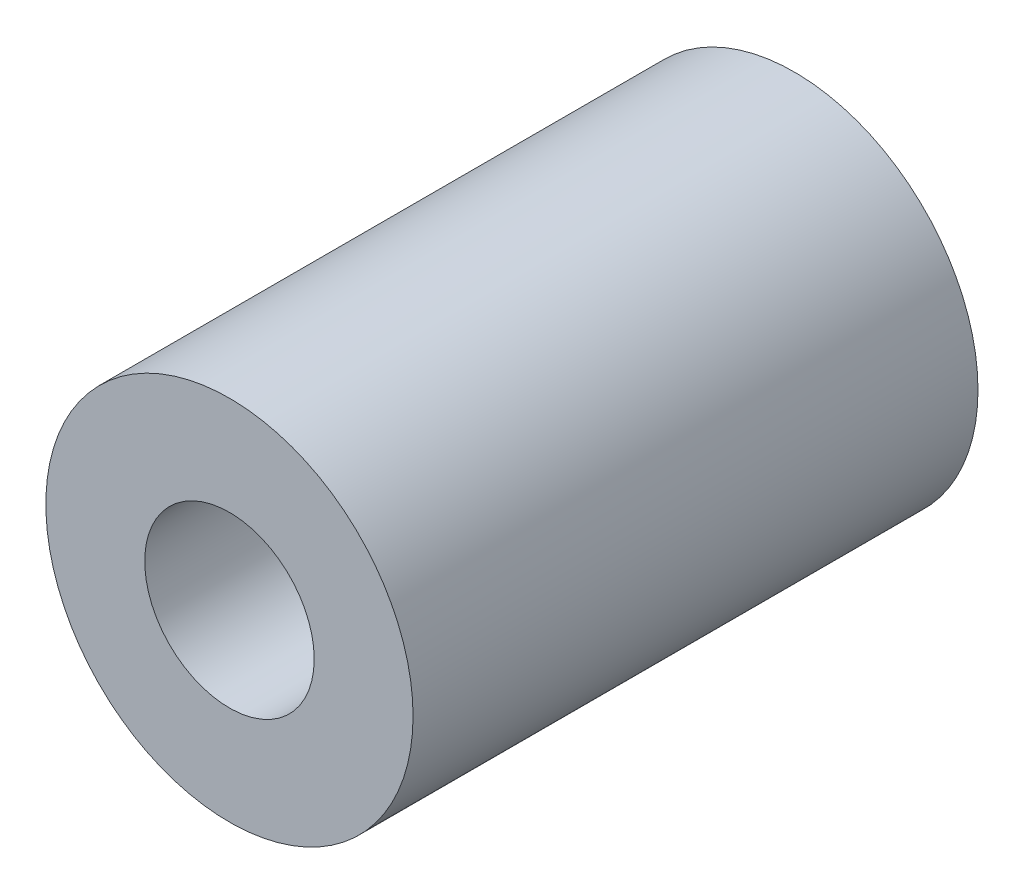
ISO-10303-21;
HEADER;
FILE_DESCRIPTION(('STEP AP214'),'2;1');
FILE_NAME('part.step','',(''),(''),'','','');
FILE_SCHEMA(('AUTOMOTIVE_DESIGN { 1 0 10303 214 1 1 1 1 }'));
ENDSEC;
DATA;
#1=APPLICATION_CONTEXT('core data for automotive mechanical design processes');
#2=APPLICATION_PROTOCOL_DEFINITION('international standard','automotive_design',2000,#1);
#3=PRODUCT_CONTEXT('',#1,'mechanical');
#4=PRODUCT('Part','Part','',(#3));
#5=PRODUCT_RELATED_PRODUCT_CATEGORY('part','',(#4));
#6=PRODUCT_DEFINITION_FORMATION('','',#4);
#7=PRODUCT_DEFINITION_CONTEXT('part definition',#1,'design');
#8=PRODUCT_DEFINITION('design','',#6,#7);
#9=PRODUCT_DEFINITION_SHAPE('','',#8);
#10=(LENGTH_UNIT() NAMED_UNIT(*) SI_UNIT(.MILLI.,.METRE.));
#11=(NAMED_UNIT(*) PLANE_ANGLE_UNIT() SI_UNIT($,.RADIAN.));
#12=(NAMED_UNIT(*) SI_UNIT($,.STERADIAN.) SOLID_ANGLE_UNIT());
#13=UNCERTAINTY_MEASURE_WITH_UNIT(LENGTH_MEASURE(1.E-05),#10,'distance_accuracy_value','');
#14=(GEOMETRIC_REPRESENTATION_CONTEXT(3) GLOBAL_UNCERTAINTY_ASSIGNED_CONTEXT((#13)) GLOBAL_UNIT_ASSIGNED_CONTEXT((#10,
#11,#12)) REPRESENTATION_CONTEXT('',''));
#15=CARTESIAN_POINT('',(0.,0.,0.));
#16=DIRECTION('',(0.,0.,1.));
#17=DIRECTION('',(1.,0.,0.));
#18=AXIS2_PLACEMENT_3D('',#15,#16,#17);
#19=CARTESIAN_POINT('',(0.,0.,20.));
#20=DIRECTION('',(0.,0.,1.));
#21=DIRECTION('',(1.,0.,0.));
#22=AXIS2_PLACEMENT_3D('',#19,#20,#21);
#23=PLANE('',#22);
#24=CARTESIAN_POINT('',(0.,0.,20.));
#25=DIRECTION('',(0.,0.,1.));
#26=DIRECTION('',(1.,0.,0.));
#27=AXIS2_PLACEMENT_3D('',#24,#25,#26);
#28=CIRCLE('',#27,6.5);
#29=CARTESIAN_POINT('',(6.5,0.,20.));
#30=VERTEX_POINT('',#29);
#31=EDGE_CURVE('E10',#30,#30,#28,.T.);
#32=ORIENTED_EDGE('',*,*,#31,.T.);
#33=EDGE_LOOP('',(#32));
#34=FACE_BOUND('',#33,.T.);
#35=CARTESIAN_POINT('',(0.,0.,20.));
#36=DIRECTION('',(0.,0.,1.));
#37=DIRECTION('',(1.,0.,0.));
#38=AXIS2_PLACEMENT_3D('',#35,#36,#37);
#39=CIRCLE('',#38,3.);
#40=CARTESIAN_POINT('',(3.,0.,20.));
#41=VERTEX_POINT('',#40);
#42=EDGE_CURVE('E42',#41,#41,#39,.T.);
#43=ORIENTED_EDGE('',*,*,#42,.F.);
#44=EDGE_LOOP('',(#43));
#45=FACE_BOUND('',#44,.T.);
#46=ADVANCED_FACE('F31',(#34,#45),#23,.T.);
#47=CARTESIAN_POINT('',(0.,0.,0.));
#48=DIRECTION('',(0.,0.,1.));
#49=DIRECTION('',(1.,0.,0.));
#50=AXIS2_PLACEMENT_3D('',#47,#48,#49);
#51=PLANE('',#50);
#52=CARTESIAN_POINT('',(0.,0.,0.));
#53=DIRECTION('',(0.,0.,1.));
#54=DIRECTION('',(1.,0.,0.));
#55=AXIS2_PLACEMENT_3D('',#52,#53,#54);
#56=CIRCLE('',#55,6.5);
#57=CARTESIAN_POINT('',(6.5,0.,0.));
#58=VERTEX_POINT('',#57);
#59=EDGE_CURVE('E35',#58,#58,#56,.T.);
#60=ORIENTED_EDGE('',*,*,#59,.F.);
#61=EDGE_LOOP('',(#60));
#62=FACE_BOUND('',#61,.T.);
#63=CARTESIAN_POINT('',(0.,0.,0.));
#64=DIRECTION('',(0.,0.,1.));
#65=DIRECTION('',(1.,0.,0.));
#66=AXIS2_PLACEMENT_3D('',#63,#64,#65);
#67=CIRCLE('',#66,3.);
#68=CARTESIAN_POINT('',(3.,0.,0.));
#69=VERTEX_POINT('',#68);
#70=EDGE_CURVE('E44',#69,#69,#67,.T.);
#71=ORIENTED_EDGE('',*,*,#70,.T.);
#72=EDGE_LOOP('',(#71));
#73=FACE_BOUND('',#72,.T.);
#74=ADVANCED_FACE('F54',(#62,#73),#51,.F.);
#75=CARTESIAN_POINT('',(0.,0.,20.));
#76=DIRECTION('',(0.,0.,-1.));
#77=DIRECTION('',(-1.,0.,0.));
#78=AXIS2_PLACEMENT_3D('',#75,#76,#77);
#79=CYLINDRICAL_SURFACE('',#78,6.5);
#80=ORIENTED_EDGE('',*,*,#31,.F.);
#81=EDGE_LOOP('',(#80));
#82=FACE_BOUND('',#81,.T.);
#83=ORIENTED_EDGE('',*,*,#59,.T.);
#84=EDGE_LOOP('',(#83));
#85=FACE_BOUND('',#84,.T.);
#86=ADVANCED_FACE('F33',(#82,#85),#79,.T.);
#87=CARTESIAN_POINT('',(0.,0.,20.));
#88=DIRECTION('',(0.,0.,-1.));
#89=DIRECTION('',(-1.,0.,0.));
#90=AXIS2_PLACEMENT_3D('',#87,#88,#89);
#91=CYLINDRICAL_SURFACE('',#90,3.);
#92=ORIENTED_EDGE('',*,*,#42,.T.);
#93=EDGE_LOOP('',(#92));
#94=FACE_BOUND('',#93,.T.);
#95=ORIENTED_EDGE('',*,*,#70,.F.);
#96=EDGE_LOOP('',(#95));
#97=FACE_BOUND('',#96,.T.);
#98=ADVANCED_FACE('F50',(#94,#97),#91,.F.);
#99=CLOSED_SHELL('',(#46,#74,#86,#98));
#100=MANIFOLD_SOLID_BREP('B2',#99);
#101=ADVANCED_BREP_SHAPE_REPRESENTATION('',(#18,#100),#14);
#102=SHAPE_DEFINITION_REPRESENTATION(#9,#101);
ENDSEC;
END-ISO-10303-21;
